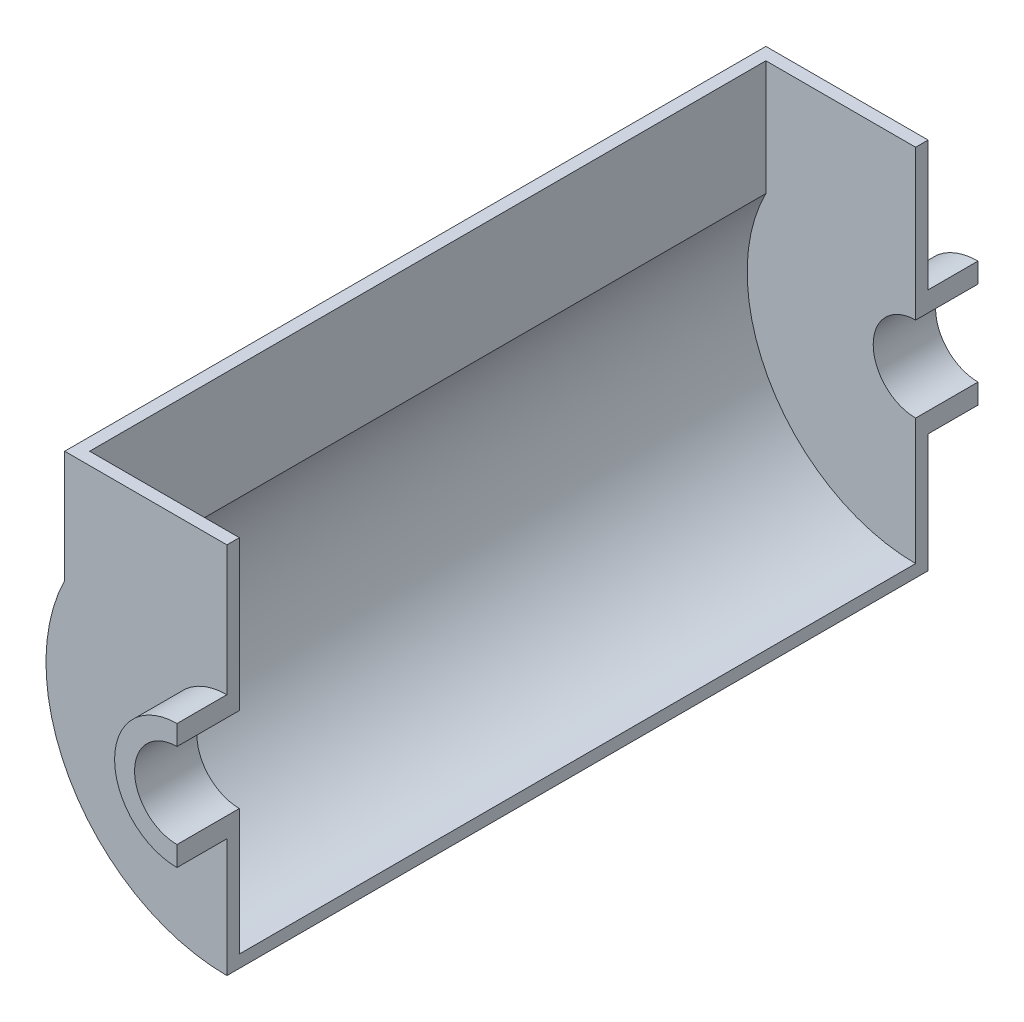
ISO-10303-21;
HEADER;
FILE_DESCRIPTION(('STEP AP214'),'2;1');
FILE_NAME('part.step','',(''),(''),'','','');
FILE_SCHEMA(('AUTOMOTIVE_DESIGN { 1 0 10303 214 1 1 1 1 }'));
ENDSEC;
DATA;
#1=APPLICATION_CONTEXT('core data for automotive mechanical design processes');
#2=APPLICATION_PROTOCOL_DEFINITION('international standard','automotive_design',2000,#1);
#3=PRODUCT_CONTEXT('',#1,'mechanical');
#4=PRODUCT('Part','Part','',(#3));
#5=PRODUCT_RELATED_PRODUCT_CATEGORY('part','',(#4));
#6=PRODUCT_DEFINITION_FORMATION('','',#4);
#7=PRODUCT_DEFINITION_CONTEXT('part definition',#1,'design');
#8=PRODUCT_DEFINITION('design','',#6,#7);
#9=PRODUCT_DEFINITION_SHAPE('','',#8);
#10=(LENGTH_UNIT() NAMED_UNIT(*) SI_UNIT(.MILLI.,.METRE.));
#11=(NAMED_UNIT(*) PLANE_ANGLE_UNIT() SI_UNIT($,.RADIAN.));
#12=(NAMED_UNIT(*) SI_UNIT($,.STERADIAN.) SOLID_ANGLE_UNIT());
#13=UNCERTAINTY_MEASURE_WITH_UNIT(LENGTH_MEASURE(1.E-05),#10,'distance_accuracy_value','');
#14=(GEOMETRIC_REPRESENTATION_CONTEXT(3) GLOBAL_UNCERTAINTY_ASSIGNED_CONTEXT((#13)) GLOBAL_UNIT_ASSIGNED_CONTEXT((#10,
#11,#12)) REPRESENTATION_CONTEXT('',''));
#15=CARTESIAN_POINT('',(0.,0.,0.));
#16=DIRECTION('',(0.,0.,1.));
#17=DIRECTION('',(1.,0.,0.));
#18=AXIS2_PLACEMENT_3D('',#15,#16,#17);
#19=CARTESIAN_POINT('',(0.,0.,-5.));
#20=DIRECTION('',(0.,0.,1.));
#21=DIRECTION('',(1.,0.,0.));
#22=AXIS2_PLACEMENT_3D('',#19,#20,#21);
#23=CYLINDRICAL_SURFACE('',#22,17.);
#24=DIRECTION('',(0.,0.,1.));
#25=VECTOR('',#24,1.);
#26=CARTESIAN_POINT('',(0.,17.,-5.));
#27=LINE('',#26,#25);
#28=CARTESIAN_POINT('',(0.,17.,-5.));
#29=VERTEX_POINT('',#28);
#30=CARTESIAN_POINT('',(0.,17.,20.));
#31=VERTEX_POINT('',#30);
#32=EDGE_CURVE('E46',#29,#31,#27,.T.);
#33=ORIENTED_EDGE('',*,*,#32,.T.);
#34=CARTESIAN_POINT('',(0.,0.,20.));
#35=DIRECTION('',(0.,0.,-1.));
#36=DIRECTION('',(1.,0.,0.));
#37=AXIS2_PLACEMENT_3D('',#34,#35,#36);
#38=CIRCLE('',#37,17.);
#39=CARTESIAN_POINT('',(0.,-17.,20.));
#40=VERTEX_POINT('',#39);
#41=EDGE_CURVE('E263',#40,#31,#38,.T.);
#42=ORIENTED_EDGE('',*,*,#41,.F.);
#43=DIRECTION('',(0.,0.,1.));
#44=VECTOR('',#43,1.);
#45=CARTESIAN_POINT('',(0.,-17.,-5.));
#46=LINE('',#45,#44);
#47=CARTESIAN_POINT('',(0.,-17.,-5.));
#48=VERTEX_POINT('',#47);
#49=EDGE_CURVE('E11',#48,#40,#46,.T.);
#50=ORIENTED_EDGE('',*,*,#49,.F.);
#51=CARTESIAN_POINT('',(0.,0.,-5.));
#52=DIRECTION('',(0.,0.,-1.));
#53=DIRECTION('',(1.,0.,0.));
#54=AXIS2_PLACEMENT_3D('',#51,#52,#53);
#55=CIRCLE('',#54,17.);
#56=EDGE_CURVE('E287',#48,#29,#55,.T.);
#57=ORIENTED_EDGE('',*,*,#56,.T.);
#58=EDGE_LOOP('',(#33,#42,#50,#57));
#59=FACE_BOUND('',#58,.T.);
#60=ADVANCED_FACE('F43',(#59),#23,.F.);
#61=CARTESIAN_POINT('',(0.,-17.,-5.));
#62=DIRECTION('',(1.,0.,0.));
#63=DIRECTION('',(0.,0.,-1.));
#64=AXIS2_PLACEMENT_3D('',#61,#62,#63);
#65=PLANE('',#64);
#66=ORIENTED_EDGE('',*,*,#49,.T.);
#67=DIRECTION('',(0.,1.,0.));
#68=VECTOR('',#67,1.);
#69=CARTESIAN_POINT('',(0.,-17.,20.));
#70=LINE('',#69,#68);
#71=CARTESIAN_POINT('',(0.,-25.,20.));
#72=VERTEX_POINT('',#71);
#73=EDGE_CURVE('E283',#72,#40,#70,.T.);
#74=ORIENTED_EDGE('',*,*,#73,.F.);
#75=DIRECTION('',(0.,0.,1.));
#76=VECTOR('',#75,1.);
#77=CARTESIAN_POINT('',(0.,-25.,-5.));
#78=LINE('',#77,#76);
#79=CARTESIAN_POINT('',(0.,-25.,0.));
#80=VERTEX_POINT('',#79);
#81=EDGE_CURVE('E52',#80,#72,#78,.T.);
#82=ORIENTED_EDGE('',*,*,#81,.F.);
#83=DIRECTION('',(0.,1.,0.));
#84=VECTOR('',#83,1.);
#85=CARTESIAN_POINT('',(0.,-25.,0.));
#86=LINE('',#85,#84);
#87=CARTESIAN_POINT('',(0.,-72.5,0.));
#88=VERTEX_POINT('',#87);
#89=EDGE_CURVE('E237',#88,#80,#86,.T.);
#90=ORIENTED_EDGE('',*,*,#89,.F.);
#91=DIRECTION('',(0.,0.,1.));
#92=VECTOR('',#91,1.);
#93=CARTESIAN_POINT('',(0.,-72.5,-5.));
#94=LINE('',#93,#92);
#95=CARTESIAN_POINT('',(0.,-72.5,-281.));
#96=VERTEX_POINT('',#95);
#97=EDGE_CURVE('E260',#96,#88,#94,.T.);
#98=ORIENTED_EDGE('',*,*,#97,.F.);
#99=DIRECTION('',(0.,1.,0.));
#100=VECTOR('',#99,1.);
#101=CARTESIAN_POINT('',(0.,-25.,-281.));
#102=LINE('',#101,#100);
#103=CARTESIAN_POINT('',(0.,-25.,-281.));
#104=VERTEX_POINT('',#103);
#105=EDGE_CURVE('E170',#96,#104,#102,.T.);
#106=ORIENTED_EDGE('',*,*,#105,.T.);
#107=DIRECTION('',(0.,0.,-1.));
#108=VECTOR('',#107,1.);
#109=CARTESIAN_POINT('',(0.,-25.,-276.));
#110=LINE('',#109,#108);
#111=CARTESIAN_POINT('',(0.,-25.,-301.));
#112=VERTEX_POINT('',#111);
#113=EDGE_CURVE('E202',#104,#112,#110,.T.);
#114=ORIENTED_EDGE('',*,*,#113,.T.);
#115=DIRECTION('',(0.,1.,0.));
#116=VECTOR('',#115,1.);
#117=CARTESIAN_POINT('',(0.,-17.,-301.));
#118=LINE('',#117,#116);
#119=CARTESIAN_POINT('',(0.,-17.,-301.));
#120=VERTEX_POINT('',#119);
#121=EDGE_CURVE('E193',#112,#120,#118,.T.);
#122=ORIENTED_EDGE('',*,*,#121,.T.);
#123=DIRECTION('',(0.,0.,-1.));
#124=VECTOR('',#123,1.);
#125=CARTESIAN_POINT('',(0.,-17.,-276.));
#126=LINE('',#125,#124);
#127=CARTESIAN_POINT('',(0.,-17.,-276.));
#128=VERTEX_POINT('',#127);
#129=EDGE_CURVE('E197',#128,#120,#126,.T.);
#130=ORIENTED_EDGE('',*,*,#129,.F.);
#131=DIRECTION('',(0.,1.,0.));
#132=VECTOR('',#131,1.);
#133=CARTESIAN_POINT('',(0.,-17.,-276.));
#134=LINE('',#133,#132);
#135=CARTESIAN_POINT('',(0.,-67.5,-276.));
#136=VERTEX_POINT('',#135);
#137=EDGE_CURVE('E187',#136,#128,#134,.T.);
#138=ORIENTED_EDGE('',*,*,#137,.F.);
#139=DIRECTION('',(0.,0.,1.));
#140=VECTOR('',#139,1.);
#141=CARTESIAN_POINT('',(0.,-67.5,-442.152038807834));
#142=LINE('',#141,#140);
#143=CARTESIAN_POINT('',(0.,-67.5,-5.));
#144=VERTEX_POINT('',#143);
#145=EDGE_CURVE('E215',#136,#144,#142,.T.);
#146=ORIENTED_EDGE('',*,*,#145,.T.);
#147=DIRECTION('',(0.,1.,0.));
#148=VECTOR('',#147,1.);
#149=CARTESIAN_POINT('',(0.,-17.,-5.));
#150=LINE('',#149,#148);
#151=EDGE_CURVE('E66',#144,#48,#150,.T.);
#152=ORIENTED_EDGE('',*,*,#151,.T.);
#153=EDGE_LOOP('',(#66,#74,#82,#90,#98,#106,#114,#122,#130,#138,#146,#152));
#154=FACE_BOUND('',#153,.T.);
#155=ADVANCED_FACE('F314',(#154),#65,.T.);
#156=CARTESIAN_POINT('',(0.,0.,-5.));
#157=DIRECTION('',(0.,0.,1.));
#158=DIRECTION('',(1.,0.,0.));
#159=AXIS2_PLACEMENT_3D('',#156,#157,#158);
#160=CYLINDRICAL_SURFACE('',#159,25.);
#161=CARTESIAN_POINT('',(0.,0.,0.));
#162=DIRECTION('',(0.,0.,-1.));
#163=DIRECTION('',(1.,0.,0.));
#164=AXIS2_PLACEMENT_3D('',#161,#162,#163);
#165=CIRCLE('',#164,25.);
#166=CARTESIAN_POINT('',(0.,25.,0.));
#167=VERTEX_POINT('',#166);
#168=EDGE_CURVE('E218',#80,#167,#165,.T.);
#169=ORIENTED_EDGE('',*,*,#168,.F.);
#170=ORIENTED_EDGE('',*,*,#81,.T.);
#171=CARTESIAN_POINT('',(0.,0.,20.));
#172=DIRECTION('',(0.,0.,1.));
#173=DIRECTION('',(1.,0.,0.));
#174=AXIS2_PLACEMENT_3D('',#171,#172,#173);
#175=CIRCLE('',#174,25.);
#176=CARTESIAN_POINT('',(0.,25.,20.));
#177=VERTEX_POINT('',#176);
#178=EDGE_CURVE('E279',#177,#72,#175,.T.);
#179=ORIENTED_EDGE('',*,*,#178,.F.);
#180=DIRECTION('',(0.,0.,1.));
#181=VECTOR('',#180,1.);
#182=CARTESIAN_POINT('',(0.,25.,-5.));
#183=LINE('',#182,#181);
#184=EDGE_CURVE('E297',#167,#177,#183,.T.);
#185=ORIENTED_EDGE('',*,*,#184,.F.);
#186=EDGE_LOOP('',(#169,#170,#179,#185));
#187=FACE_BOUND('',#186,.T.);
#188=ADVANCED_FACE('F322',(#187),#160,.T.);
#189=CARTESIAN_POINT('',(0.,25.,-5.));
#190=DIRECTION('',(1.,0.,0.));
#191=DIRECTION('',(0.,0.,-1.));
#192=AXIS2_PLACEMENT_3D('',#189,#190,#191);
#193=PLANE('',#192);
#194=DIRECTION('',(0.,1.,0.));
#195=VECTOR('',#194,1.);
#196=CARTESIAN_POINT('',(0.,25.,-5.));
#197=LINE('',#196,#195);
#198=CARTESIAN_POINT('',(0.,77.,-5.));
#199=VERTEX_POINT('',#198);
#200=EDGE_CURVE('E291',#29,#199,#197,.T.);
#201=ORIENTED_EDGE('',*,*,#200,.T.);
#202=DIRECTION('',(0.,0.,1.));
#203=VECTOR('',#202,1.);
#204=CARTESIAN_POINT('',(0.,77.,-5.));
#205=LINE('',#204,#203);
#206=CARTESIAN_POINT('',(0.,77.,0.));
#207=VERTEX_POINT('',#206);
#208=EDGE_CURVE('E236',#199,#207,#205,.T.);
#209=ORIENTED_EDGE('',*,*,#208,.T.);
#210=DIRECTION('',(0.,1.,0.));
#211=VECTOR('',#210,1.);
#212=CARTESIAN_POINT('',(0.,25.,0.));
#213=LINE('',#212,#211);
#214=EDGE_CURVE('E241',#167,#207,#213,.T.);
#215=ORIENTED_EDGE('',*,*,#214,.F.);
#216=ORIENTED_EDGE('',*,*,#184,.T.);
#217=DIRECTION('',(0.,1.,0.));
#218=VECTOR('',#217,1.);
#219=CARTESIAN_POINT('',(0.,25.,20.));
#220=LINE('',#219,#218);
#221=EDGE_CURVE('E275',#31,#177,#220,.T.);
#222=ORIENTED_EDGE('',*,*,#221,.F.);
#223=ORIENTED_EDGE('',*,*,#32,.F.);
#224=EDGE_LOOP('',(#201,#209,#215,#216,#222,#223));
#225=FACE_BOUND('',#224,.T.);
#226=ADVANCED_FACE('F307',(#225),#193,.T.);
#227=CARTESIAN_POINT('',(0.,0.,-5.));
#228=DIRECTION('',(0.,0.,1.));
#229=DIRECTION('',(1.,0.,0.));
#230=AXIS2_PLACEMENT_3D('',#227,#228,#229);
#231=PLANE('',#230);
#232=ORIENTED_EDGE('',*,*,#151,.F.);
#233=CARTESIAN_POINT('',(0.,0.,-5.));
#234=DIRECTION('',(0.,0.,-1.));
#235=DIRECTION('',(-1.,0.,0.));
#236=AXIS2_PLACEMENT_3D('',#233,#234,#235);
#237=CIRCLE('',#236,67.5);
#238=CARTESIAN_POINT('',(-60.,30.9232921921324,-5.));
#239=VERTEX_POINT('',#238);
#240=EDGE_CURVE('E212',#144,#239,#237,.T.);
#241=ORIENTED_EDGE('',*,*,#240,.T.);
#242=DIRECTION('',(0.,-1.,0.));
#243=VECTOR('',#242,1.);
#244=CARTESIAN_POINT('',(-60.,77.,-5.));
#245=LINE('',#244,#243);
#246=CARTESIAN_POINT('',(-60.,77.,-5.));
#247=VERTEX_POINT('',#246);
#248=EDGE_CURVE('E60',#247,#239,#245,.T.);
#249=ORIENTED_EDGE('',*,*,#248,.F.);
#250=DIRECTION('',(-1.,0.,0.));
#251=VECTOR('',#250,1.);
#252=CARTESIAN_POINT('',(0.,77.,-5.));
#253=LINE('',#252,#251);
#254=EDGE_CURVE('E233',#199,#247,#253,.T.);
#255=ORIENTED_EDGE('',*,*,#254,.F.);
#256=ORIENTED_EDGE('',*,*,#200,.F.);
#257=ORIENTED_EDGE('',*,*,#56,.F.);
#258=EDGE_LOOP('',(#232,#241,#249,#255,#256,#257));
#259=FACE_BOUND('',#258,.T.);
#260=ADVANCED_FACE('F316',(#259),#231,.F.);
#261=CARTESIAN_POINT('',(0.,0.,20.));
#262=DIRECTION('',(0.,0.,1.));
#263=DIRECTION('',(1.,0.,0.));
#264=AXIS2_PLACEMENT_3D('',#261,#262,#263);
#265=PLANE('',#264);
#266=ORIENTED_EDGE('',*,*,#41,.T.);
#267=ORIENTED_EDGE('',*,*,#221,.T.);
#268=ORIENTED_EDGE('',*,*,#178,.T.);
#269=ORIENTED_EDGE('',*,*,#73,.T.);
#270=EDGE_LOOP('',(#266,#267,#268,#269));
#271=FACE_BOUND('',#270,.T.);
#272=ADVANCED_FACE('F310',(#271),#265,.T.);
#273=CARTESIAN_POINT('',(0.,0.,-5.));
#274=DIRECTION('',(0.,0.,1.));
#275=DIRECTION('',(1.,0.,0.));
#276=AXIS2_PLACEMENT_3D('',#273,#274,#275);
#277=CYLINDRICAL_SURFACE('',#276,72.5);
#278=CARTESIAN_POINT('',(0.,0.,0.));
#279=DIRECTION('',(0.,0.,1.));
#280=DIRECTION('',(1.,0.,0.));
#281=AXIS2_PLACEMENT_3D('',#278,#279,#280);
#282=CIRCLE('',#281,72.5);
#283=CARTESIAN_POINT('',(-65.,32.1130814466628,0.));
#284=VERTEX_POINT('',#283);
#285=EDGE_CURVE('E253',#284,#88,#282,.T.);
#286=ORIENTED_EDGE('',*,*,#285,.F.);
#287=DIRECTION('',(0.,0.,1.));
#288=VECTOR('',#287,1.);
#289=CARTESIAN_POINT('',(-65.,32.1130814466628,-5.));
#290=LINE('',#289,#288);
#291=CARTESIAN_POINT('',(-65.,32.1130814466628,-281.));
#292=VERTEX_POINT('',#291);
#293=EDGE_CURVE('E264',#292,#284,#290,.T.);
#294=ORIENTED_EDGE('',*,*,#293,.F.);
#295=CARTESIAN_POINT('',(0.,0.,-281.));
#296=DIRECTION('',(0.,0.,1.));
#297=DIRECTION('',(1.,0.,0.));
#298=AXIS2_PLACEMENT_3D('',#295,#296,#297);
#299=CIRCLE('',#298,72.5);
#300=EDGE_CURVE('E572',#292,#96,#299,.T.);
#301=ORIENTED_EDGE('',*,*,#300,.T.);
#302=ORIENTED_EDGE('',*,*,#97,.T.);
#303=EDGE_LOOP('',(#286,#294,#301,#302));
#304=FACE_BOUND('',#303,.T.);
#305=ADVANCED_FACE('F363',(#304),#277,.T.);
#306=CARTESIAN_POINT('',(-65.,77.,-5.));
#307=DIRECTION('',(-1.,0.,0.));
#308=DIRECTION('',(0.,-1.,0.));
#309=AXIS2_PLACEMENT_3D('',#306,#307,#308);
#310=PLANE('',#309);
#311=DIRECTION('',(0.,-1.,0.));
#312=VECTOR('',#311,1.);
#313=CARTESIAN_POINT('',(-65.,77.,0.));
#314=LINE('',#313,#312);
#315=CARTESIAN_POINT('',(-65.,77.,0.));
#316=VERTEX_POINT('',#315);
#317=EDGE_CURVE('E249',#316,#284,#314,.T.);
#318=ORIENTED_EDGE('',*,*,#317,.F.);
#319=DIRECTION('',(0.,0.,1.));
#320=VECTOR('',#319,1.);
#321=CARTESIAN_POINT('',(-65.,77.,-5.));
#322=LINE('',#321,#320);
#323=CARTESIAN_POINT('',(-65.,77.,-281.));
#324=VERTEX_POINT('',#323);
#325=EDGE_CURVE('E267',#324,#316,#322,.T.);
#326=ORIENTED_EDGE('',*,*,#325,.F.);
#327=DIRECTION('',(0.,-1.,0.));
#328=VECTOR('',#327,1.);
#329=CARTESIAN_POINT('',(-65.,77.,-281.));
#330=LINE('',#329,#328);
#331=EDGE_CURVE('E575',#324,#292,#330,.T.);
#332=ORIENTED_EDGE('',*,*,#331,.T.);
#333=ORIENTED_EDGE('',*,*,#293,.T.);
#334=EDGE_LOOP('',(#318,#326,#332,#333));
#335=FACE_BOUND('',#334,.T.);
#336=ADVANCED_FACE('F367',(#335),#310,.T.);
#337=CARTESIAN_POINT('',(0.,77.,-5.));
#338=DIRECTION('',(0.,1.,0.));
#339=DIRECTION('',(0.,0.,1.));
#340=AXIS2_PLACEMENT_3D('',#337,#338,#339);
#341=PLANE('',#340);
#342=DIRECTION('',(-1.,0.,0.));
#343=VECTOR('',#342,1.);
#344=CARTESIAN_POINT('',(0.,77.,0.));
#345=LINE('',#344,#343);
#346=EDGE_CURVE('E245',#207,#316,#345,.T.);
#347=ORIENTED_EDGE('',*,*,#346,.F.);
#348=ORIENTED_EDGE('',*,*,#208,.F.);
#349=ORIENTED_EDGE('',*,*,#254,.T.);
#350=DIRECTION('',(0.,0.,1.));
#351=VECTOR('',#350,1.);
#352=CARTESIAN_POINT('',(-60.,77.,-442.152038807834));
#353=LINE('',#352,#351);
#354=CARTESIAN_POINT('',(-60.,77.,-276.));
#355=VERTEX_POINT('',#354);
#356=EDGE_CURVE('E165',#355,#247,#353,.T.);
#357=ORIENTED_EDGE('',*,*,#356,.F.);
#358=DIRECTION('',(-1.,0.,0.));
#359=VECTOR('',#358,1.);
#360=CARTESIAN_POINT('',(0.,77.,-276.));
#361=LINE('',#360,#359);
#362=CARTESIAN_POINT('',(0.,77.,-276.));
#363=VERTEX_POINT('',#362);
#364=EDGE_CURVE('E157',#363,#355,#361,.T.);
#365=ORIENTED_EDGE('',*,*,#364,.F.);
#366=DIRECTION('',(0.,0.,-1.));
#367=VECTOR('',#366,1.);
#368=CARTESIAN_POINT('',(0.,77.,-276.));
#369=LINE('',#368,#367);
#370=CARTESIAN_POINT('',(0.,77.,-281.));
#371=VERTEX_POINT('',#370);
#372=EDGE_CURVE('E162',#363,#371,#369,.T.);
#373=ORIENTED_EDGE('',*,*,#372,.T.);
#374=DIRECTION('',(-1.,0.,0.));
#375=VECTOR('',#374,1.);
#376=CARTESIAN_POINT('',(0.,77.,-281.));
#377=LINE('',#376,#375);
#378=EDGE_CURVE('E596',#371,#324,#377,.T.);
#379=ORIENTED_EDGE('',*,*,#378,.T.);
#380=ORIENTED_EDGE('',*,*,#325,.T.);
#381=EDGE_LOOP('',(#347,#348,#349,#357,#365,#373,#379,#380));
#382=FACE_BOUND('',#381,.T.);
#383=ADVANCED_FACE('F160',(#382),#341,.T.);
#384=CARTESIAN_POINT('',(0.,0.,0.));
#385=DIRECTION('',(0.,0.,1.));
#386=DIRECTION('',(1.,0.,0.));
#387=AXIS2_PLACEMENT_3D('',#384,#385,#386);
#388=PLANE('',#387);
#389=ORIENTED_EDGE('',*,*,#168,.T.);
#390=ORIENTED_EDGE('',*,*,#214,.T.);
#391=ORIENTED_EDGE('',*,*,#346,.T.);
#392=ORIENTED_EDGE('',*,*,#317,.T.);
#393=ORIENTED_EDGE('',*,*,#285,.T.);
#394=ORIENTED_EDGE('',*,*,#89,.T.);
#395=EDGE_LOOP('',(#389,#390,#391,#392,#393,#394));
#396=FACE_BOUND('',#395,.T.);
#397=ADVANCED_FACE('F320',(#396),#388,.T.);
#398=CARTESIAN_POINT('',(0.,0.,-442.152038807834));
#399=DIRECTION('',(0.,0.,1.));
#400=DIRECTION('',(1.,0.,0.));
#401=AXIS2_PLACEMENT_3D('',#398,#399,#400);
#402=CYLINDRICAL_SURFACE('',#401,67.5);
#403=ORIENTED_EDGE('',*,*,#145,.F.);
#404=CARTESIAN_POINT('',(0.,0.,-276.));
#405=DIRECTION('',(0.,0.,-1.));
#406=DIRECTION('',(-1.,0.,0.));
#407=AXIS2_PLACEMENT_3D('',#404,#405,#406);
#408=CIRCLE('',#407,67.5);
#409=CARTESIAN_POINT('',(-60.,30.9232921921324,-276.));
#410=VERTEX_POINT('',#409);
#411=EDGE_CURVE('E221',#136,#410,#408,.T.);
#412=ORIENTED_EDGE('',*,*,#411,.T.);
#413=DIRECTION('',(0.,0.,1.));
#414=VECTOR('',#413,1.);
#415=CARTESIAN_POINT('',(-60.,30.9232921921324,-442.152038807834));
#416=LINE('',#415,#414);
#417=EDGE_CURVE('E225',#410,#239,#416,.T.);
#418=ORIENTED_EDGE('',*,*,#417,.T.);
#419=ORIENTED_EDGE('',*,*,#240,.F.);
#420=EDGE_LOOP('',(#403,#412,#418,#419));
#421=FACE_BOUND('',#420,.T.);
#422=ADVANCED_FACE('F393',(#421),#402,.F.);
#423=CARTESIAN_POINT('',(-60.,77.,-442.152038807834));
#424=DIRECTION('',(-1.,0.,0.));
#425=DIRECTION('',(0.,0.,1.));
#426=AXIS2_PLACEMENT_3D('',#423,#424,#425);
#427=PLANE('',#426);
#428=DIRECTION('',(0.,-1.,0.));
#429=VECTOR('',#428,1.);
#430=CARTESIAN_POINT('',(-60.,77.,-276.));
#431=LINE('',#430,#429);
#432=EDGE_CURVE('E201',#355,#410,#431,.T.);
#433=ORIENTED_EDGE('',*,*,#432,.F.);
#434=ORIENTED_EDGE('',*,*,#356,.T.);
#435=ORIENTED_EDGE('',*,*,#248,.T.);
#436=ORIENTED_EDGE('',*,*,#417,.F.);
#437=EDGE_LOOP('',(#433,#434,#435,#436));
#438=FACE_BOUND('',#437,.T.);
#439=ADVANCED_FACE('F397',(#438),#427,.F.);
#440=CARTESIAN_POINT('',(0.,0.,-276.));
#441=DIRECTION('',(0.,0.,-1.));
#442=DIRECTION('',(1.,0.,0.));
#443=AXIS2_PLACEMENT_3D('',#440,#441,#442);
#444=CYLINDRICAL_SURFACE('',#443,17.);
#445=DIRECTION('',(0.,0.,-1.));
#446=VECTOR('',#445,1.);
#447=CARTESIAN_POINT('',(0.,17.,-276.));
#448=LINE('',#447,#446);
#449=CARTESIAN_POINT('',(0.,17.,-276.));
#450=VERTEX_POINT('',#449);
#451=CARTESIAN_POINT('',(0.,17.,-301.));
#452=VERTEX_POINT('',#451);
#453=EDGE_CURVE('E191',#450,#452,#448,.T.);
#454=ORIENTED_EDGE('',*,*,#453,.F.);
#455=CARTESIAN_POINT('',(0.,0.,-276.));
#456=DIRECTION('',(0.,0.,-1.));
#457=DIRECTION('',(1.,0.,0.));
#458=AXIS2_PLACEMENT_3D('',#455,#456,#457);
#459=CIRCLE('',#458,17.);
#460=EDGE_CURVE('E184',#128,#450,#459,.T.);
#461=ORIENTED_EDGE('',*,*,#460,.F.);
#462=ORIENTED_EDGE('',*,*,#129,.T.);
#463=CARTESIAN_POINT('',(0.,0.,-301.));
#464=DIRECTION('',(0.,0.,-1.));
#465=DIRECTION('',(1.,0.,0.));
#466=AXIS2_PLACEMENT_3D('',#463,#464,#465);
#467=CIRCLE('',#466,17.);
#468=EDGE_CURVE('E180',#120,#452,#467,.T.);
#469=ORIENTED_EDGE('',*,*,#468,.T.);
#470=EDGE_LOOP('',(#454,#461,#462,#469));
#471=FACE_BOUND('',#470,.T.);
#472=ADVANCED_FACE('F408',(#471),#444,.F.);
#473=CARTESIAN_POINT('',(0.,0.,-276.));
#474=DIRECTION('',(0.,0.,-1.));
#475=DIRECTION('',(1.,0.,0.));
#476=AXIS2_PLACEMENT_3D('',#473,#474,#475);
#477=CYLINDRICAL_SURFACE('',#476,25.);
#478=CARTESIAN_POINT('',(0.,0.,-281.));
#479=DIRECTION('',(0.,0.,-1.));
#480=DIRECTION('',(1.,0.,0.));
#481=AXIS2_PLACEMENT_3D('',#478,#479,#480);
#482=CIRCLE('',#481,25.);
#483=CARTESIAN_POINT('',(0.,25.,-281.));
#484=VERTEX_POINT('',#483);
#485=EDGE_CURVE('E561',#104,#484,#482,.T.);
#486=ORIENTED_EDGE('',*,*,#485,.T.);
#487=DIRECTION('',(0.,0.,-1.));
#488=VECTOR('',#487,1.);
#489=CARTESIAN_POINT('',(0.,25.,-276.));
#490=LINE('',#489,#488);
#491=CARTESIAN_POINT('',(0.,25.,-301.));
#492=VERTEX_POINT('',#491);
#493=EDGE_CURVE('E206',#484,#492,#490,.T.);
#494=ORIENTED_EDGE('',*,*,#493,.T.);
#495=CARTESIAN_POINT('',(0.,0.,-301.));
#496=DIRECTION('',(0.,0.,1.));
#497=DIRECTION('',(1.,0.,0.));
#498=AXIS2_PLACEMENT_3D('',#495,#496,#497);
#499=CIRCLE('',#498,25.);
#500=EDGE_CURVE('E568',#492,#112,#499,.T.);
#501=ORIENTED_EDGE('',*,*,#500,.T.);
#502=ORIENTED_EDGE('',*,*,#113,.F.);
#503=EDGE_LOOP('',(#486,#494,#501,#502));
#504=FACE_BOUND('',#503,.T.);
#505=ADVANCED_FACE('F419',(#504),#477,.T.);
#506=CARTESIAN_POINT('',(0.,25.,-276.));
#507=DIRECTION('',(1.,0.,0.));
#508=DIRECTION('',(0.,0.,1.));
#509=AXIS2_PLACEMENT_3D('',#506,#507,#508);
#510=PLANE('',#509);
#511=DIRECTION('',(0.,1.,0.));
#512=VECTOR('',#511,1.);
#513=CARTESIAN_POINT('',(0.,25.,-276.));
#514=LINE('',#513,#512);
#515=EDGE_CURVE('E175',#450,#363,#514,.T.);
#516=ORIENTED_EDGE('',*,*,#515,.F.);
#517=ORIENTED_EDGE('',*,*,#453,.T.);
#518=DIRECTION('',(0.,1.,0.));
#519=VECTOR('',#518,1.);
#520=CARTESIAN_POINT('',(0.,25.,-301.));
#521=LINE('',#520,#519);
#522=EDGE_CURVE('E582',#452,#492,#521,.T.);
#523=ORIENTED_EDGE('',*,*,#522,.T.);
#524=ORIENTED_EDGE('',*,*,#493,.F.);
#525=DIRECTION('',(0.,1.,0.));
#526=VECTOR('',#525,1.);
#527=CARTESIAN_POINT('',(0.,25.,-281.));
#528=LINE('',#527,#526);
#529=EDGE_CURVE('E178',#484,#371,#528,.T.);
#530=ORIENTED_EDGE('',*,*,#529,.T.);
#531=ORIENTED_EDGE('',*,*,#372,.F.);
#532=EDGE_LOOP('',(#516,#517,#523,#524,#530,#531));
#533=FACE_BOUND('',#532,.T.);
#534=ADVANCED_FACE('F173',(#533),#510,.T.);
#535=CARTESIAN_POINT('',(0.,0.,-276.));
#536=DIRECTION('',(0.,0.,-1.));
#537=DIRECTION('',(1.,0.,0.));
#538=AXIS2_PLACEMENT_3D('',#535,#536,#537);
#539=PLANE('',#538);
#540=ORIENTED_EDGE('',*,*,#364,.T.);
#541=ORIENTED_EDGE('',*,*,#432,.T.);
#542=ORIENTED_EDGE('',*,*,#411,.F.);
#543=ORIENTED_EDGE('',*,*,#137,.T.);
#544=ORIENTED_EDGE('',*,*,#460,.T.);
#545=ORIENTED_EDGE('',*,*,#515,.T.);
#546=EDGE_LOOP('',(#540,#541,#542,#543,#544,#545));
#547=FACE_BOUND('',#546,.T.);
#548=ADVANCED_FACE('F182',(#547),#539,.F.);
#549=CARTESIAN_POINT('',(0.,0.,-301.));
#550=DIRECTION('',(0.,0.,-1.));
#551=DIRECTION('',(1.,0.,0.));
#552=AXIS2_PLACEMENT_3D('',#549,#550,#551);
#553=PLANE('',#552);
#554=ORIENTED_EDGE('',*,*,#468,.F.);
#555=ORIENTED_EDGE('',*,*,#121,.F.);
#556=ORIENTED_EDGE('',*,*,#500,.F.);
#557=ORIENTED_EDGE('',*,*,#522,.F.);
#558=EDGE_LOOP('',(#554,#555,#556,#557));
#559=FACE_BOUND('',#558,.T.);
#560=ADVANCED_FACE('F447',(#559),#553,.T.);
#561=CARTESIAN_POINT('',(0.,0.,-281.));
#562=DIRECTION('',(0.,0.,-1.));
#563=DIRECTION('',(1.,0.,0.));
#564=AXIS2_PLACEMENT_3D('',#561,#562,#563);
#565=PLANE('',#564);
#566=ORIENTED_EDGE('',*,*,#485,.F.);
#567=ORIENTED_EDGE('',*,*,#105,.F.);
#568=ORIENTED_EDGE('',*,*,#300,.F.);
#569=ORIENTED_EDGE('',*,*,#331,.F.);
#570=ORIENTED_EDGE('',*,*,#378,.F.);
#571=ORIENTED_EDGE('',*,*,#529,.F.);
#572=EDGE_LOOP('',(#566,#567,#568,#569,#570,#571));
#573=FACE_BOUND('',#572,.T.);
#574=ADVANCED_FACE('F456',(#573),#565,.T.);
#575=CLOSED_SHELL('',(#60,#155,#188,#226,#260,#272,#305,#336,#383,#397,#422,#439,#472,#505,#534,
#548,#560,#574));
#576=MANIFOLD_SOLID_BREP('B2',#575);
#577=ADVANCED_BREP_SHAPE_REPRESENTATION('',(#18,#576),#14);
#578=SHAPE_DEFINITION_REPRESENTATION(#9,#577);
ENDSEC;
END-ISO-10303-21;
